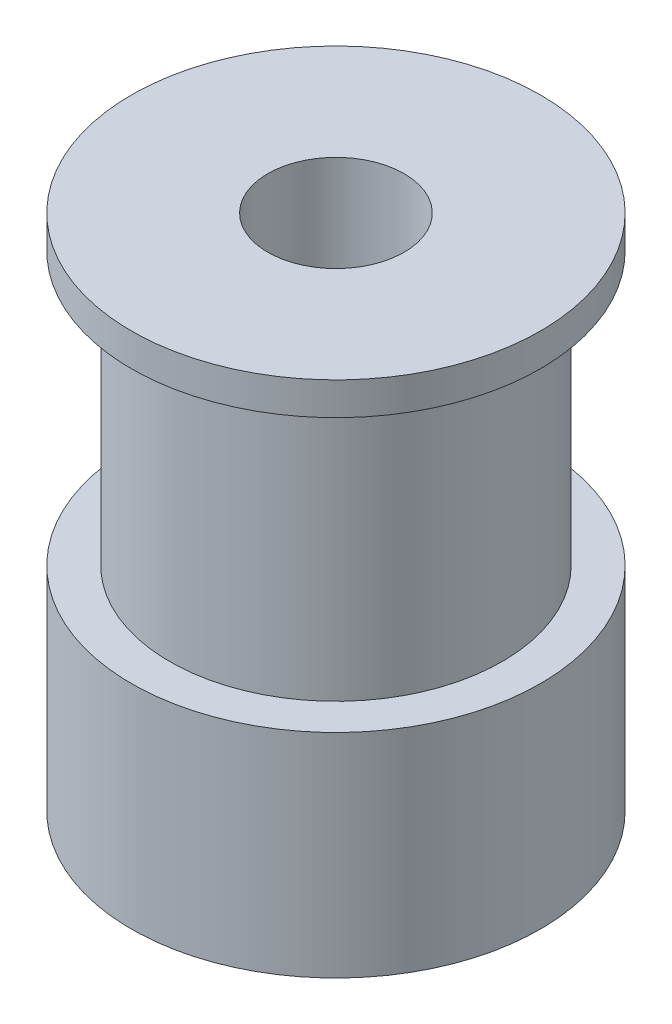
ISO-10303-21;
HEADER;
FILE_DESCRIPTION(('STEP AP214'),'2;1');
FILE_NAME('part.step','',(''),(''),'','','');
FILE_SCHEMA(('AUTOMOTIVE_DESIGN { 1 0 10303 214 1 1 1 1 }'));
ENDSEC;
DATA;
#1=APPLICATION_CONTEXT('core data for automotive mechanical design processes');
#2=APPLICATION_PROTOCOL_DEFINITION('international standard','automotive_design',2000,#1);
#3=PRODUCT_CONTEXT('',#1,'mechanical');
#4=PRODUCT('Part','Part','',(#3));
#5=PRODUCT_RELATED_PRODUCT_CATEGORY('part','',(#4));
#6=PRODUCT_DEFINITION_FORMATION('','',#4);
#7=PRODUCT_DEFINITION_CONTEXT('part definition',#1,'design');
#8=PRODUCT_DEFINITION('design','',#6,#7);
#9=PRODUCT_DEFINITION_SHAPE('','',#8);
#10=(LENGTH_UNIT() NAMED_UNIT(*) SI_UNIT(.MILLI.,.METRE.));
#11=(NAMED_UNIT(*) PLANE_ANGLE_UNIT() SI_UNIT($,.RADIAN.));
#12=(NAMED_UNIT(*) SI_UNIT($,.STERADIAN.) SOLID_ANGLE_UNIT());
#13=UNCERTAINTY_MEASURE_WITH_UNIT(LENGTH_MEASURE(1.E-05),#10,'distance_accuracy_value','');
#14=(GEOMETRIC_REPRESENTATION_CONTEXT(3) GLOBAL_UNCERTAINTY_ASSIGNED_CONTEXT((#13)) GLOBAL_UNIT_ASSIGNED_CONTEXT((#10,
#11,#12)) REPRESENTATION_CONTEXT('',''));
#15=CARTESIAN_POINT('',(0.,0.,0.));
#16=DIRECTION('',(0.,0.,1.));
#17=DIRECTION('',(1.,0.,0.));
#18=AXIS2_PLACEMENT_3D('',#15,#16,#17);
#19=CARTESIAN_POINT('',(-7.5,0.,0.));
#20=DIRECTION('',(0.,1.,0.));
#21=DIRECTION('',(0.,0.,1.));
#22=AXIS2_PLACEMENT_3D('',#19,#20,#21);
#23=PLANE('',#22);
#24=CARTESIAN_POINT('',(0.,0.,0.));
#25=DIRECTION('',(0.,-1.,0.));
#26=DIRECTION('',(0.,0.,-1.));
#27=AXIS2_PLACEMENT_3D('',#24,#25,#26);
#28=CIRCLE('',#27,2.5);
#29=CARTESIAN_POINT('',(0.,0.,-2.5));
#30=VERTEX_POINT('',#29);
#31=EDGE_CURVE('E10',#30,#30,#28,.T.);
#32=ORIENTED_EDGE('',*,*,#31,.F.);
#33=EDGE_LOOP('',(#32));
#34=FACE_BOUND('',#33,.T.);
#35=CARTESIAN_POINT('',(0.,0.,0.));
#36=DIRECTION('',(0.,-1.,0.));
#37=DIRECTION('',(0.,0.,-1.));
#38=AXIS2_PLACEMENT_3D('',#35,#36,#37);
#39=CIRCLE('',#38,7.5);
#40=CARTESIAN_POINT('',(0.,0.,-7.5));
#41=VERTEX_POINT('',#40);
#42=EDGE_CURVE('E60',#41,#41,#39,.T.);
#43=ORIENTED_EDGE('',*,*,#42,.T.);
#44=EDGE_LOOP('',(#43));
#45=FACE_BOUND('',#44,.T.);
#46=ADVANCED_FACE('F32',(#34,#45),#23,.F.);
#47=CARTESIAN_POINT('',(0.,0.,0.));
#48=DIRECTION('',(0.,-1.,0.));
#49=DIRECTION('',(0.,0.,-1.));
#50=AXIS2_PLACEMENT_3D('',#47,#48,#49);
#51=CYLINDRICAL_SURFACE('',#50,2.5);
#52=CARTESIAN_POINT('',(0.,19.,0.));
#53=DIRECTION('',(0.,-1.,0.));
#54=DIRECTION('',(0.,0.,-1.));
#55=AXIS2_PLACEMENT_3D('',#52,#53,#54);
#56=CIRCLE('',#55,2.5);
#57=CARTESIAN_POINT('',(0.,19.,-2.5));
#58=VERTEX_POINT('',#57);
#59=EDGE_CURVE('E38',#58,#58,#56,.T.);
#60=ORIENTED_EDGE('',*,*,#59,.F.);
#61=EDGE_LOOP('',(#60));
#62=FACE_BOUND('',#61,.T.);
#63=ORIENTED_EDGE('',*,*,#31,.T.);
#64=EDGE_LOOP('',(#63));
#65=FACE_BOUND('',#64,.T.);
#66=ADVANCED_FACE('F97',(#62,#65),#51,.F.);
#67=CARTESIAN_POINT('',(-2.5,19.,0.));
#68=DIRECTION('',(0.,-1.,0.));
#69=DIRECTION('',(0.,0.,-1.));
#70=AXIS2_PLACEMENT_3D('',#67,#68,#69);
#71=PLANE('',#70);
#72=CARTESIAN_POINT('',(0.,19.,0.));
#73=DIRECTION('',(0.,-1.,0.));
#74=DIRECTION('',(0.,0.,-1.));
#75=AXIS2_PLACEMENT_3D('',#72,#73,#74);
#76=CIRCLE('',#75,7.5);
#77=CARTESIAN_POINT('',(0.,19.,-7.5));
#78=VERTEX_POINT('',#77);
#79=EDGE_CURVE('E42',#78,#78,#76,.T.);
#80=ORIENTED_EDGE('',*,*,#79,.F.);
#81=EDGE_LOOP('',(#80));
#82=FACE_BOUND('',#81,.T.);
#83=ORIENTED_EDGE('',*,*,#59,.T.);
#84=EDGE_LOOP('',(#83));
#85=FACE_BOUND('',#84,.T.);
#86=ADVANCED_FACE('F92',(#82,#85),#71,.F.);
#87=CARTESIAN_POINT('',(0.,0.,0.));
#88=DIRECTION('',(0.,-1.,0.));
#89=DIRECTION('',(0.,0.,-1.));
#90=AXIS2_PLACEMENT_3D('',#87,#88,#89);
#91=CYLINDRICAL_SURFACE('',#90,7.5);
#92=CARTESIAN_POINT('',(0.,17.8,0.));
#93=DIRECTION('',(0.,-1.,0.));
#94=DIRECTION('',(0.,0.,-1.));
#95=AXIS2_PLACEMENT_3D('',#92,#93,#94);
#96=CIRCLE('',#95,7.5);
#97=CARTESIAN_POINT('',(0.,17.8,-7.5));
#98=VERTEX_POINT('',#97);
#99=EDGE_CURVE('E46',#98,#98,#96,.T.);
#100=ORIENTED_EDGE('',*,*,#99,.F.);
#101=EDGE_LOOP('',(#100));
#102=FACE_BOUND('',#101,.T.);
#103=ORIENTED_EDGE('',*,*,#79,.T.);
#104=EDGE_LOOP('',(#103));
#105=FACE_BOUND('',#104,.T.);
#106=ADVANCED_FACE('F86',(#102,#105),#91,.T.);
#107=CARTESIAN_POINT('',(-7.5,17.8,0.));
#108=DIRECTION('',(0.,1.,0.));
#109=DIRECTION('',(0.,0.,1.));
#110=AXIS2_PLACEMENT_3D('',#107,#108,#109);
#111=PLANE('',#110);
#112=CARTESIAN_POINT('',(0.,17.8,0.));
#113=DIRECTION('',(0.,-1.,0.));
#114=DIRECTION('',(0.,0.,-1.));
#115=AXIS2_PLACEMENT_3D('',#112,#113,#114);
#116=CIRCLE('',#115,6.1);
#117=CARTESIAN_POINT('',(0.,17.8,-6.1));
#118=VERTEX_POINT('',#117);
#119=EDGE_CURVE('E51',#118,#118,#116,.T.);
#120=ORIENTED_EDGE('',*,*,#119,.F.);
#121=EDGE_LOOP('',(#120));
#122=FACE_BOUND('',#121,.T.);
#123=ORIENTED_EDGE('',*,*,#99,.T.);
#124=EDGE_LOOP('',(#123));
#125=FACE_BOUND('',#124,.T.);
#126=ADVANCED_FACE('F80',(#122,#125),#111,.F.);
#127=CARTESIAN_POINT('',(0.,0.,0.));
#128=DIRECTION('',(0.,-1.,0.));
#129=DIRECTION('',(0.,0.,-1.));
#130=AXIS2_PLACEMENT_3D('',#127,#128,#129);
#131=CYLINDRICAL_SURFACE('',#130,6.1);
#132=CARTESIAN_POINT('',(0.,7.8,0.));
#133=DIRECTION('',(0.,-1.,0.));
#134=DIRECTION('',(0.,0.,-1.));
#135=AXIS2_PLACEMENT_3D('',#132,#133,#134);
#136=CIRCLE('',#135,6.1);
#137=CARTESIAN_POINT('',(0.,7.8,-6.1));
#138=VERTEX_POINT('',#137);
#139=EDGE_CURVE('E54',#138,#138,#136,.T.);
#140=ORIENTED_EDGE('',*,*,#139,.F.);
#141=EDGE_LOOP('',(#140));
#142=FACE_BOUND('',#141,.T.);
#143=ORIENTED_EDGE('',*,*,#119,.T.);
#144=EDGE_LOOP('',(#143));
#145=FACE_BOUND('',#144,.T.);
#146=ADVANCED_FACE('F74',(#142,#145),#131,.T.);
#147=CARTESIAN_POINT('',(-6.1,7.8,0.));
#148=DIRECTION('',(0.,-1.,0.));
#149=DIRECTION('',(0.,0.,-1.));
#150=AXIS2_PLACEMENT_3D('',#147,#148,#149);
#151=PLANE('',#150);
#152=CARTESIAN_POINT('',(0.,7.8,0.));
#153=DIRECTION('',(0.,-1.,0.));
#154=DIRECTION('',(0.,0.,-1.));
#155=AXIS2_PLACEMENT_3D('',#152,#153,#154);
#156=CIRCLE('',#155,7.5);
#157=CARTESIAN_POINT('',(0.,7.8,-7.5));
#158=VERTEX_POINT('',#157);
#159=EDGE_CURVE('E57',#158,#158,#156,.T.);
#160=ORIENTED_EDGE('',*,*,#159,.F.);
#161=EDGE_LOOP('',(#160));
#162=FACE_BOUND('',#161,.T.);
#163=ORIENTED_EDGE('',*,*,#139,.T.);
#164=EDGE_LOOP('',(#163));
#165=FACE_BOUND('',#164,.T.);
#166=ADVANCED_FACE('F68',(#162,#165),#151,.F.);
#167=CARTESIAN_POINT('',(0.,0.,0.));
#168=DIRECTION('',(0.,-1.,0.));
#169=DIRECTION('',(0.,0.,-1.));
#170=AXIS2_PLACEMENT_3D('',#167,#168,#169);
#171=CYLINDRICAL_SURFACE('',#170,7.5);
#172=ORIENTED_EDGE('',*,*,#42,.F.);
#173=EDGE_LOOP('',(#172));
#174=FACE_BOUND('',#173,.T.);
#175=ORIENTED_EDGE('',*,*,#159,.T.);
#176=EDGE_LOOP('',(#175));
#177=FACE_BOUND('',#176,.T.);
#178=ADVANCED_FACE('F65',(#174,#177),#171,.T.);
#179=CLOSED_SHELL('',(#46,#66,#86,#106,#126,#146,#166,#178));
#180=MANIFOLD_SOLID_BREP('B2',#179);
#181=ADVANCED_BREP_SHAPE_REPRESENTATION('',(#18,#180),#14);
#182=SHAPE_DEFINITION_REPRESENTATION(#9,#181);
ENDSEC;
END-ISO-10303-21;
